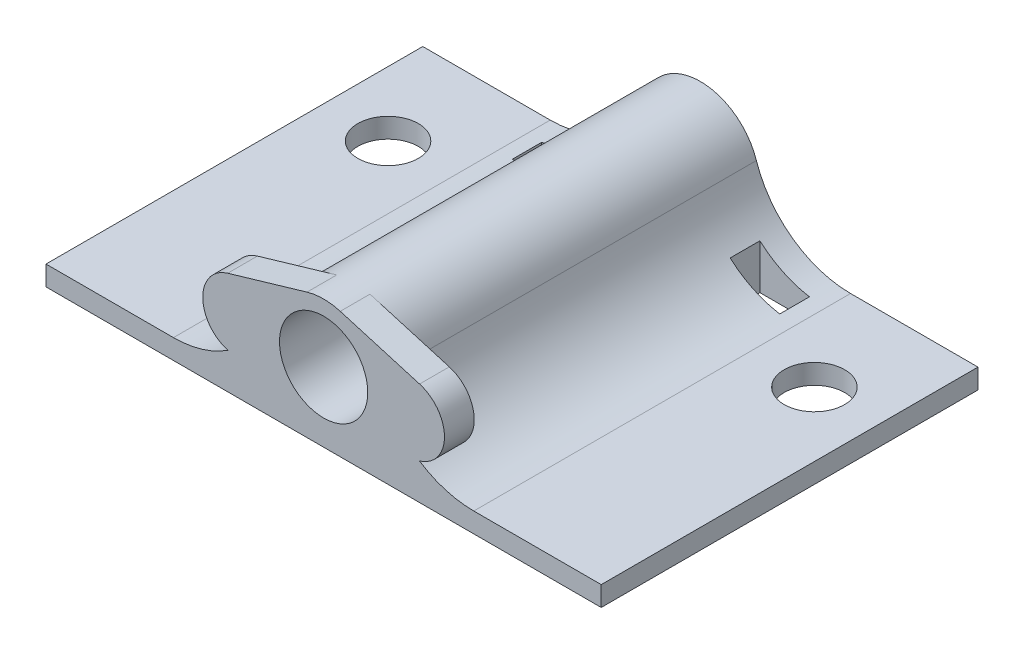
ISO-10303-21;
HEADER;
FILE_DESCRIPTION(('STEP AP214'),'2;1');
FILE_NAME('part.step','',(''),(''),'','','');
FILE_SCHEMA(('AUTOMOTIVE_DESIGN { 1 0 10303 214 1 1 1 1 }'));
ENDSEC;
DATA;
#1=APPLICATION_CONTEXT('core data for automotive mechanical design processes');
#2=APPLICATION_PROTOCOL_DEFINITION('international standard','automotive_design',2000,#1);
#3=PRODUCT_CONTEXT('',#1,'mechanical');
#4=PRODUCT('Part','Part','',(#3));
#5=PRODUCT_RELATED_PRODUCT_CATEGORY('part','',(#4));
#6=PRODUCT_DEFINITION_FORMATION('','',#4);
#7=PRODUCT_DEFINITION_CONTEXT('part definition',#1,'design');
#8=PRODUCT_DEFINITION('design','',#6,#7);
#9=PRODUCT_DEFINITION_SHAPE('','',#8);
#10=(LENGTH_UNIT() NAMED_UNIT(*) SI_UNIT(.MILLI.,.METRE.));
#11=(NAMED_UNIT(*) PLANE_ANGLE_UNIT() SI_UNIT($,.RADIAN.));
#12=(NAMED_UNIT(*) SI_UNIT($,.STERADIAN.) SOLID_ANGLE_UNIT());
#13=UNCERTAINTY_MEASURE_WITH_UNIT(LENGTH_MEASURE(1.E-05),#10,'distance_accuracy_value','');
#14=(GEOMETRIC_REPRESENTATION_CONTEXT(3) GLOBAL_UNCERTAINTY_ASSIGNED_CONTEXT((#13)) GLOBAL_UNIT_ASSIGNED_CONTEXT((#10,
#11,#12)) REPRESENTATION_CONTEXT('',''));
#15=CARTESIAN_POINT('',(0.,0.,0.));
#16=DIRECTION('',(0.,0.,1.));
#17=DIRECTION('',(1.,0.,0.));
#18=AXIS2_PLACEMENT_3D('',#15,#16,#17);
#19=CARTESIAN_POINT('',(0.,0.,35.));
#20=DIRECTION('',(0.,0.,-1.));
#21=DIRECTION('',(-1.,0.,0.));
#22=AXIS2_PLACEMENT_3D('',#19,#20,#21);
#23=CYLINDRICAL_SURFACE('',#22,4.45);
#24=CARTESIAN_POINT('',(0.,0.,38.));
#25=DIRECTION('',(0.,0.,1.));
#26=DIRECTION('',(1.,0.,0.));
#27=AXIS2_PLACEMENT_3D('',#24,#25,#26);
#28=CIRCLE('',#27,4.45);
#29=CARTESIAN_POINT('',(4.45,0.,38.));
#30=VERTEX_POINT('',#29);
#31=EDGE_CURVE('E324',#30,#30,#28,.F.);
#32=ORIENTED_EDGE('',*,*,#31,.F.);
#33=EDGE_LOOP('',(#32));
#34=FACE_BOUND('',#33,.T.);
#35=CARTESIAN_POINT('',(0.,0.,0.));
#36=DIRECTION('',(0.,0.,-1.));
#37=DIRECTION('',(-1.,0.,0.));
#38=AXIS2_PLACEMENT_3D('',#35,#36,#37);
#39=CIRCLE('',#38,4.45);
#40=CARTESIAN_POINT('',(-4.45,0.,0.));
#41=VERTEX_POINT('',#40);
#42=EDGE_CURVE('E235',#41,#41,#39,.T.);
#43=ORIENTED_EDGE('',*,*,#42,.T.);
#44=EDGE_LOOP('',(#43));
#45=FACE_BOUND('',#44,.T.);
#46=ADVANCED_FACE('F40',(#34,#45),#23,.F.);
#47=CARTESIAN_POINT('',(0.,0.,35.));
#48=DIRECTION('',(0.,0.,1.));
#49=DIRECTION('',(1.,0.,0.));
#50=AXIS2_PLACEMENT_3D('',#47,#48,#49);
#51=PLANE('',#50);
#52=CARTESIAN_POINT('',(0.,0.,35.));
#53=DIRECTION('',(0.,0.,1.));
#54=DIRECTION('',(1.,0.,0.));
#55=AXIS2_PLACEMENT_3D('',#52,#53,#54);
#56=CIRCLE('',#55,5.95);
#57=CARTESIAN_POINT('',(-1.6773711862172,5.70867111538652,35.));
#58=VERTEX_POINT('',#57);
#59=CARTESIAN_POINT('',(-5.65008981584658,1.86520376175549,35.));
#60=VERTEX_POINT('',#59);
#61=EDGE_CURVE('E360',#58,#60,#56,.T.);
#62=ORIENTED_EDGE('',*,*,#61,.T.);
#63=CARTESIAN_POINT('',(-15.146039086177,5.,35.));
#64=DIRECTION('',(0.,0.,1.));
#65=DIRECTION('',(1.,0.,0.));
#66=AXIS2_PLACEMENT_3D('',#63,#64,#65);
#67=CIRCLE('',#66,10.);
#68=CARTESIAN_POINT('',(-9.66244493894468,-3.36242759182045,35.));
#69=VERTEX_POINT('',#68);
#70=EDGE_CURVE('E375',#60,#69,#67,.F.);
#71=ORIENTED_EDGE('',*,*,#70,.T.);
#72=DIRECTION('',(-0.959440523594372,0.281911123733982,0.));
#73=VECTOR('',#72,1.);
#74=CARTESIAN_POINT('',(-1.67737118621719,-5.70867111538652,35.));
#75=LINE('',#74,#73);
#76=CARTESIAN_POINT('',(-9.67737118621719,-3.3580418325803,35.));
#77=VERTEX_POINT('',#76);
#78=EDGE_CURVE('E339',#69,#77,#75,.T.);
#79=ORIENTED_EDGE('',*,*,#78,.T.);
#80=CARTESIAN_POINT('',(-8.69068225314826,0.,35.));
#81=DIRECTION('',(0.,0.,1.));
#82=DIRECTION('',(1.,0.,0.));
#83=AXIS2_PLACEMENT_3D('',#80,#81,#82);
#84=CIRCLE('',#83,3.5);
#85=CARTESIAN_POINT('',(-9.67737118621719,3.3580418325803,35.));
#86=VERTEX_POINT('',#85);
#87=EDGE_CURVE('E336',#77,#86,#84,.F.);
#88=ORIENTED_EDGE('',*,*,#87,.T.);
#89=DIRECTION('',(-0.959440523594372,-0.281911123733982,0.));
#90=VECTOR('',#89,1.);
#91=CARTESIAN_POINT('',(-1.67737118621719,5.70867111538652,35.));
#92=LINE('',#91,#90);
#93=EDGE_CURVE('E333',#58,#86,#92,.T.);
#94=ORIENTED_EDGE('',*,*,#93,.F.);
#95=EDGE_LOOP('',(#62,#71,#79,#88,#94));
#96=FACE_BOUND('',#95,.T.);
#97=ADVANCED_FACE('F428',(#96),#51,.F.);
#98=DIRECTION('',(0.959440523594372,0.281911123733982,0.));
#99=VECTOR('',#98,1.);
#100=CARTESIAN_POINT('',(1.67737118621719,-5.70867111538652,35.));
#101=LINE('',#100,#99);
#102=CARTESIAN_POINT('',(9.66244493894468,-3.36242759182045,35.));
#103=VERTEX_POINT('',#102);
#104=CARTESIAN_POINT('',(9.67737118621719,-3.3580418325803,35.));
#105=VERTEX_POINT('',#104);
#106=EDGE_CURVE('E310',#103,#105,#101,.T.);
#107=ORIENTED_EDGE('',*,*,#106,.F.);
#108=CARTESIAN_POINT('',(15.146039086177,5.,35.));
#109=DIRECTION('',(0.,0.,1.));
#110=DIRECTION('',(1.,0.,0.));
#111=AXIS2_PLACEMENT_3D('',#108,#109,#110);
#112=CIRCLE('',#111,10.);
#113=CARTESIAN_POINT('',(5.65008981584658,1.86520376175549,35.));
#114=VERTEX_POINT('',#113);
#115=EDGE_CURVE('E373',#103,#114,#112,.F.);
#116=ORIENTED_EDGE('',*,*,#115,.T.);
#117=CARTESIAN_POINT('',(1.67737118621719,5.70867111538652,35.));
#118=VERTEX_POINT('',#117);
#119=EDGE_CURVE('E358',#114,#118,#56,.T.);
#120=ORIENTED_EDGE('',*,*,#119,.T.);
#121=DIRECTION('',(0.959440523594372,-0.281911123733982,0.));
#122=VECTOR('',#121,1.);
#123=CARTESIAN_POINT('',(1.67737118621719,5.70867111538652,35.));
#124=LINE('',#123,#122);
#125=CARTESIAN_POINT('',(9.67737118621719,3.3580418325803,35.));
#126=VERTEX_POINT('',#125);
#127=EDGE_CURVE('E330',#118,#126,#124,.T.);
#128=ORIENTED_EDGE('',*,*,#127,.T.);
#129=CARTESIAN_POINT('',(8.69068225314826,0.,35.));
#130=DIRECTION('',(0.,0.,1.));
#131=DIRECTION('',(1.,0.,0.));
#132=AXIS2_PLACEMENT_3D('',#129,#130,#131);
#133=CIRCLE('',#132,3.5);
#134=EDGE_CURVE('E299',#126,#105,#133,.F.);
#135=ORIENTED_EDGE('',*,*,#134,.T.);
#136=EDGE_LOOP('',(#107,#116,#120,#128,#135));
#137=FACE_BOUND('',#136,.T.);
#138=ADVANCED_FACE('F434',(#137),#51,.F.);
#139=CARTESIAN_POINT('',(8.69068225314826,0.,38.));
#140=DIRECTION('',(0.,0.,-1.));
#141=DIRECTION('',(-1.,0.,0.));
#142=AXIS2_PLACEMENT_3D('',#139,#140,#141);
#143=CYLINDRICAL_SURFACE('',#142,3.5);
#144=ORIENTED_EDGE('',*,*,#134,.F.);
#145=DIRECTION('',(0.,0.,-1.));
#146=VECTOR('',#145,1.);
#147=CARTESIAN_POINT('',(9.67737118621719,3.3580418325803,38.));
#148=LINE('',#147,#146);
#149=CARTESIAN_POINT('',(9.67737118621719,3.3580418325803,38.));
#150=VERTEX_POINT('',#149);
#151=EDGE_CURVE('E355',#150,#126,#148,.T.);
#152=ORIENTED_EDGE('',*,*,#151,.F.);
#153=CARTESIAN_POINT('',(8.69068225314826,0.,38.));
#154=DIRECTION('',(0.,0.,1.));
#155=DIRECTION('',(1.,0.,0.));
#156=AXIS2_PLACEMENT_3D('',#153,#154,#155);
#157=CIRCLE('',#156,3.5);
#158=CARTESIAN_POINT('',(9.67737118621719,-3.3580418325803,38.));
#159=VERTEX_POINT('',#158);
#160=EDGE_CURVE('E306',#150,#159,#157,.F.);
#161=ORIENTED_EDGE('',*,*,#160,.T.);
#162=DIRECTION('',(0.,0.,-1.));
#163=VECTOR('',#162,1.);
#164=CARTESIAN_POINT('',(9.67737118621719,-3.3580418325803,38.));
#165=LINE('',#164,#163);
#166=EDGE_CURVE('E327',#159,#105,#165,.T.);
#167=ORIENTED_EDGE('',*,*,#166,.T.);
#168=EDGE_LOOP('',(#144,#152,#161,#167));
#169=FACE_BOUND('',#168,.T.);
#170=ADVANCED_FACE('F441',(#169),#143,.T.);
#171=CARTESIAN_POINT('',(1.67737118621719,5.70867111538652,38.));
#172=DIRECTION('',(0.281911123733982,0.959440523594372,0.));
#173=DIRECTION('',(-0.959440523594372,0.281911123733982,0.));
#174=AXIS2_PLACEMENT_3D('',#171,#172,#173);
#175=PLANE('',#174);
#176=ORIENTED_EDGE('',*,*,#127,.F.);
#177=DIRECTION('',(0.,0.,-1.));
#178=VECTOR('',#177,1.);
#179=CARTESIAN_POINT('',(1.67737118621719,5.70867111538652,38.));
#180=LINE('',#179,#178);
#181=CARTESIAN_POINT('',(1.67737118621719,5.70867111538652,38.));
#182=VERTEX_POINT('',#181);
#183=EDGE_CURVE('E352',#182,#118,#180,.T.);
#184=ORIENTED_EDGE('',*,*,#183,.F.);
#185=DIRECTION('',(0.959440523594372,-0.281911123733982,0.));
#186=VECTOR('',#185,1.);
#187=CARTESIAN_POINT('',(1.67737118621719,5.70867111538652,38.));
#188=LINE('',#187,#186);
#189=EDGE_CURVE('E309',#182,#150,#188,.T.);
#190=ORIENTED_EDGE('',*,*,#189,.T.);
#191=ORIENTED_EDGE('',*,*,#151,.T.);
#192=EDGE_LOOP('',(#176,#184,#190,#191));
#193=FACE_BOUND('',#192,.T.);
#194=ADVANCED_FACE('F503',(#193),#175,.T.);
#195=CARTESIAN_POINT('',(-1.67737118621719,5.70867111538652,38.));
#196=DIRECTION('',(0.281911123733982,-0.959440523594372,0.));
#197=DIRECTION('',(0.959440523594372,0.281911123733982,0.));
#198=AXIS2_PLACEMENT_3D('',#195,#196,#197);
#199=PLANE('',#198);
#200=ORIENTED_EDGE('',*,*,#93,.T.);
#201=DIRECTION('',(0.,0.,-1.));
#202=VECTOR('',#201,1.);
#203=CARTESIAN_POINT('',(-9.67737118621719,3.3580418325803,38.));
#204=LINE('',#203,#202);
#205=CARTESIAN_POINT('',(-9.67737118621719,3.3580418325803,38.));
#206=VERTEX_POINT('',#205);
#207=EDGE_CURVE('E347',#206,#86,#204,.T.);
#208=ORIENTED_EDGE('',*,*,#207,.F.);
#209=DIRECTION('',(-0.959440523594372,-0.281911123733982,0.));
#210=VECTOR('',#209,1.);
#211=CARTESIAN_POINT('',(-1.67737118621719,5.70867111538652,38.));
#212=LINE('',#211,#210);
#213=CARTESIAN_POINT('',(-1.67737118621719,5.70867111538652,38.));
#214=VERTEX_POINT('',#213);
#215=EDGE_CURVE('E315',#214,#206,#212,.T.);
#216=ORIENTED_EDGE('',*,*,#215,.F.);
#217=DIRECTION('',(0.,0.,-1.));
#218=VECTOR('',#217,1.);
#219=CARTESIAN_POINT('',(-1.67737118621719,5.70867111538652,38.));
#220=LINE('',#219,#218);
#221=EDGE_CURVE('E349',#214,#58,#220,.T.);
#222=ORIENTED_EDGE('',*,*,#221,.T.);
#223=EDGE_LOOP('',(#200,#208,#216,#222));
#224=FACE_BOUND('',#223,.T.);
#225=ADVANCED_FACE('F511',(#224),#199,.F.);
#226=CARTESIAN_POINT('',(-8.69068225314826,0.,38.));
#227=DIRECTION('',(0.,0.,-1.));
#228=DIRECTION('',(-1.,0.,0.));
#229=AXIS2_PLACEMENT_3D('',#226,#227,#228);
#230=CYLINDRICAL_SURFACE('',#229,3.5);
#231=ORIENTED_EDGE('',*,*,#87,.F.);
#232=DIRECTION('',(0.,0.,-1.));
#233=VECTOR('',#232,1.);
#234=CARTESIAN_POINT('',(-9.67737118621719,-3.3580418325803,38.));
#235=LINE('',#234,#233);
#236=CARTESIAN_POINT('',(-9.67737118621719,-3.3580418325803,38.));
#237=VERTEX_POINT('',#236);
#238=EDGE_CURVE('E344',#237,#77,#235,.T.);
#239=ORIENTED_EDGE('',*,*,#238,.F.);
#240=CARTESIAN_POINT('',(-8.69068225314826,0.,38.));
#241=DIRECTION('',(0.,0.,1.));
#242=DIRECTION('',(1.,0.,0.));
#243=AXIS2_PLACEMENT_3D('',#240,#241,#242);
#244=CIRCLE('',#243,3.5);
#245=EDGE_CURVE('E317',#237,#206,#244,.F.);
#246=ORIENTED_EDGE('',*,*,#245,.T.);
#247=ORIENTED_EDGE('',*,*,#207,.T.);
#248=EDGE_LOOP('',(#231,#239,#246,#247));
#249=FACE_BOUND('',#248,.T.);
#250=ADVANCED_FACE('F516',(#249),#230,.T.);
#251=CARTESIAN_POINT('',(-1.67737118621719,-5.70867111538652,38.));
#252=DIRECTION('',(-0.281911123733982,-0.959440523594372,0.));
#253=DIRECTION('',(0.959440523594372,-0.281911123733982,0.));
#254=AXIS2_PLACEMENT_3D('',#251,#252,#253);
#255=PLANE('',#254);
#256=ORIENTED_EDGE('',*,*,#78,.F.);
#257=DIRECTION('',(0.,0.,-1.));
#258=VECTOR('',#257,1.);
#259=CARTESIAN_POINT('',(-9.66244493894467,-3.36242759182045,35.));
#260=LINE('',#259,#258);
#261=CARTESIAN_POINT('',(-9.66244493894468,-3.36242759182045,38.));
#262=VERTEX_POINT('',#261);
#263=EDGE_CURVE('E377',#69,#262,#260,.F.);
#264=ORIENTED_EDGE('',*,*,#263,.T.);
#265=DIRECTION('',(-0.959440523594372,0.281911123733982,0.));
#266=VECTOR('',#265,1.);
#267=CARTESIAN_POINT('',(-1.67737118621719,-5.70867111538652,38.));
#268=LINE('',#267,#266);
#269=EDGE_CURVE('E320',#262,#237,#268,.T.);
#270=ORIENTED_EDGE('',*,*,#269,.T.);
#271=ORIENTED_EDGE('',*,*,#238,.T.);
#272=EDGE_LOOP('',(#256,#264,#270,#271));
#273=FACE_BOUND('',#272,.T.);
#274=ADVANCED_FACE('F519',(#273),#255,.T.);
#275=CARTESIAN_POINT('',(1.67737118621719,-5.70867111538652,38.));
#276=DIRECTION('',(-0.281911123733982,0.959440523594372,0.));
#277=DIRECTION('',(-0.959440523594372,-0.281911123733982,0.));
#278=AXIS2_PLACEMENT_3D('',#275,#276,#277);
#279=PLANE('',#278);
#280=DIRECTION('',(0.959440523594372,0.281911123733982,0.));
#281=VECTOR('',#280,1.);
#282=CARTESIAN_POINT('',(1.67737118621719,-5.70867111538652,38.));
#283=LINE('',#282,#281);
#284=CARTESIAN_POINT('',(9.66244493894468,-3.36242759182045,38.));
#285=VERTEX_POINT('',#284);
#286=EDGE_CURVE('E322',#285,#159,#283,.T.);
#287=ORIENTED_EDGE('',*,*,#286,.F.);
#288=DIRECTION('',(0.,0.,-1.));
#289=VECTOR('',#288,1.);
#290=CARTESIAN_POINT('',(9.66244493894467,-3.36242759182045,38.));
#291=LINE('',#290,#289);
#292=EDGE_CURVE('E371',#285,#103,#291,.T.);
#293=ORIENTED_EDGE('',*,*,#292,.T.);
#294=ORIENTED_EDGE('',*,*,#106,.T.);
#295=ORIENTED_EDGE('',*,*,#166,.F.);
#296=EDGE_LOOP('',(#287,#293,#294,#295));
#297=FACE_BOUND('',#296,.T.);
#298=ADVANCED_FACE('F496',(#297),#279,.F.);
#299=CARTESIAN_POINT('',(0.,0.,38.));
#300=DIRECTION('',(0.,0.,1.));
#301=DIRECTION('',(1.,0.,0.));
#302=AXIS2_PLACEMENT_3D('',#299,#300,#301);
#303=PLANE('',#302);
#304=ORIENTED_EDGE('',*,*,#269,.F.);
#305=CARTESIAN_POINT('',(-15.146039086177,5.,38.));
#306=DIRECTION('',(0.,0.,1.));
#307=DIRECTION('',(1.,0.,0.));
#308=AXIS2_PLACEMENT_3D('',#305,#306,#307);
#309=CIRCLE('',#308,10.);
#310=CARTESIAN_POINT('',(-15.146039086177,-5.,38.));
#311=VERTEX_POINT('',#310);
#312=EDGE_CURVE('E385',#262,#311,#309,.F.);
#313=ORIENTED_EDGE('',*,*,#312,.T.);
#314=DIRECTION('',(1.,0.,0.));
#315=VECTOR('',#314,1.);
#316=CARTESIAN_POINT('',(0.,-5.,38.));
#317=LINE('',#316,#315);
#318=CARTESIAN_POINT('',(-28.,-5.,38.));
#319=VERTEX_POINT('',#318);
#320=EDGE_CURVE('E288',#319,#311,#317,.T.);
#321=ORIENTED_EDGE('',*,*,#320,.F.);
#322=DIRECTION('',(0.,1.,0.));
#323=VECTOR('',#322,1.);
#324=CARTESIAN_POINT('',(-28.,-7.,38.));
#325=LINE('',#324,#323);
#326=CARTESIAN_POINT('',(-28.,-7.,38.));
#327=VERTEX_POINT('',#326);
#328=EDGE_CURVE('E303',#327,#319,#325,.T.);
#329=ORIENTED_EDGE('',*,*,#328,.F.);
#330=DIRECTION('',(1.,0.,0.));
#331=VECTOR('',#330,1.);
#332=CARTESIAN_POINT('',(0.,-7.,38.));
#333=LINE('',#332,#331);
#334=CARTESIAN_POINT('',(28.,-7.,38.));
#335=VERTEX_POINT('',#334);
#336=EDGE_CURVE('E269',#327,#335,#333,.T.);
#337=ORIENTED_EDGE('',*,*,#336,.T.);
#338=DIRECTION('',(0.,1.,0.));
#339=VECTOR('',#338,1.);
#340=CARTESIAN_POINT('',(28.,-7.,38.));
#341=LINE('',#340,#339);
#342=CARTESIAN_POINT('',(28.,-5.,38.));
#343=VERTEX_POINT('',#342);
#344=EDGE_CURVE('E300',#335,#343,#341,.T.);
#345=ORIENTED_EDGE('',*,*,#344,.T.);
#346=CARTESIAN_POINT('',(15.146039086177,-5.,38.));
#347=VERTEX_POINT('',#346);
#348=EDGE_CURVE('E287',#347,#343,#317,.T.);
#349=ORIENTED_EDGE('',*,*,#348,.F.);
#350=CARTESIAN_POINT('',(15.146039086177,5.,38.));
#351=DIRECTION('',(0.,0.,1.));
#352=DIRECTION('',(1.,0.,0.));
#353=AXIS2_PLACEMENT_3D('',#350,#351,#352);
#354=CIRCLE('',#353,10.);
#355=EDGE_CURVE('E383',#347,#285,#354,.F.);
#356=ORIENTED_EDGE('',*,*,#355,.T.);
#357=ORIENTED_EDGE('',*,*,#286,.T.);
#358=ORIENTED_EDGE('',*,*,#160,.F.);
#359=ORIENTED_EDGE('',*,*,#189,.F.);
#360=CARTESIAN_POINT('',(0.,0.,38.));
#361=DIRECTION('',(0.,0.,1.));
#362=DIRECTION('',(1.,0.,0.));
#363=AXIS2_PLACEMENT_3D('',#360,#361,#362);
#364=CIRCLE('',#363,5.95);
#365=EDGE_CURVE('E313',#182,#214,#364,.T.);
#366=ORIENTED_EDGE('',*,*,#365,.T.);
#367=ORIENTED_EDGE('',*,*,#215,.T.);
#368=ORIENTED_EDGE('',*,*,#245,.F.);
#369=EDGE_LOOP('',(#304,#313,#321,#329,#337,#345,#349,#356,#357,#358,#359,#366,#367,#368));
#370=FACE_BOUND('',#369,.T.);
#371=ORIENTED_EDGE('',*,*,#31,.T.);
#372=EDGE_LOOP('',(#371));
#373=FACE_BOUND('',#372,.T.);
#374=ADVANCED_FACE('F450',(#370,#373),#303,.T.);
#375=CARTESIAN_POINT('',(0.,0.,0.));
#376=DIRECTION('',(0.,0.,1.));
#377=DIRECTION('',(1.,0.,0.));
#378=AXIS2_PLACEMENT_3D('',#375,#376,#377);
#379=PLANE('',#378);
#380=ORIENTED_EDGE('',*,*,#42,.F.);
#381=EDGE_LOOP('',(#380));
#382=FACE_BOUND('',#381,.T.);
#383=CARTESIAN_POINT('',(0.,0.,0.));
#384=DIRECTION('',(0.,0.,1.));
#385=DIRECTION('',(1.,0.,0.));
#386=AXIS2_PLACEMENT_3D('',#383,#384,#385);
#387=CIRCLE('',#386,5.95);
#388=CARTESIAN_POINT('',(5.65008981584658,1.86520376175549,0.));
#389=VERTEX_POINT('',#388);
#390=CARTESIAN_POINT('',(-5.65008981584658,1.86520376175549,0.));
#391=VERTEX_POINT('',#390);
#392=EDGE_CURVE('E357',#389,#391,#387,.T.);
#393=ORIENTED_EDGE('',*,*,#392,.F.);
#394=CARTESIAN_POINT('',(15.146039086177,5.,0.));
#395=DIRECTION('',(0.,0.,1.));
#396=DIRECTION('',(1.,0.,0.));
#397=AXIS2_PLACEMENT_3D('',#394,#395,#396);
#398=CIRCLE('',#397,10.);
#399=CARTESIAN_POINT('',(15.146039086177,-5.,0.));
#400=VERTEX_POINT('',#399);
#401=EDGE_CURVE('E381',#389,#400,#398,.T.);
#402=ORIENTED_EDGE('',*,*,#401,.T.);
#403=DIRECTION('',(1.,0.,0.));
#404=VECTOR('',#403,1.);
#405=CARTESIAN_POINT('',(0.,-5.,0.));
#406=LINE('',#405,#404);
#407=CARTESIAN_POINT('',(28.,-5.,0.));
#408=VERTEX_POINT('',#407);
#409=EDGE_CURVE('E280',#400,#408,#406,.T.);
#410=ORIENTED_EDGE('',*,*,#409,.T.);
#411=DIRECTION('',(0.,1.,0.));
#412=VECTOR('',#411,1.);
#413=CARTESIAN_POINT('',(28.,-7.,0.));
#414=LINE('',#413,#412);
#415=CARTESIAN_POINT('',(28.,-7.,0.));
#416=VERTEX_POINT('',#415);
#417=EDGE_CURVE('E296',#416,#408,#414,.T.);
#418=ORIENTED_EDGE('',*,*,#417,.F.);
#419=DIRECTION('',(1.,0.,0.));
#420=VECTOR('',#419,1.);
#421=CARTESIAN_POINT('',(0.,-7.,0.));
#422=LINE('',#421,#420);
#423=CARTESIAN_POINT('',(-28.,-7.,0.));
#424=VERTEX_POINT('',#423);
#425=EDGE_CURVE('E262',#424,#416,#422,.T.);
#426=ORIENTED_EDGE('',*,*,#425,.F.);
#427=DIRECTION('',(0.,1.,0.));
#428=VECTOR('',#427,1.);
#429=CARTESIAN_POINT('',(-28.,-7.,0.));
#430=LINE('',#429,#428);
#431=CARTESIAN_POINT('',(-28.,-5.,0.));
#432=VERTEX_POINT('',#431);
#433=EDGE_CURVE('E277',#424,#432,#430,.T.);
#434=ORIENTED_EDGE('',*,*,#433,.T.);
#435=CARTESIAN_POINT('',(-15.146039086177,-5.,0.));
#436=VERTEX_POINT('',#435);
#437=EDGE_CURVE('E281',#432,#436,#406,.T.);
#438=ORIENTED_EDGE('',*,*,#437,.T.);
#439=CARTESIAN_POINT('',(-15.146039086177,5.,0.));
#440=DIRECTION('',(0.,0.,1.));
#441=DIRECTION('',(1.,0.,0.));
#442=AXIS2_PLACEMENT_3D('',#439,#440,#441);
#443=CIRCLE('',#442,10.);
#444=EDGE_CURVE('E387',#436,#391,#443,.T.);
#445=ORIENTED_EDGE('',*,*,#444,.T.);
#446=EDGE_LOOP('',(#393,#402,#410,#418,#426,#434,#438,#445));
#447=FACE_BOUND('',#446,.T.);
#448=ADVANCED_FACE('F447',(#382,#447),#379,.F.);
#449=CARTESIAN_POINT('',(0.,0.,35.));
#450=DIRECTION('',(0.,0.,-1.));
#451=DIRECTION('',(-1.,0.,0.));
#452=AXIS2_PLACEMENT_3D('',#449,#450,#451);
#453=CYLINDRICAL_SURFACE('',#452,5.95);
#454=ORIENTED_EDGE('',*,*,#119,.F.);
#455=DIRECTION('',(0.,0.,-1.));
#456=VECTOR('',#455,1.);
#457=CARTESIAN_POINT('',(5.65008981584658,1.86520376175549,35.));
#458=LINE('',#457,#456);
#459=EDGE_CURVE('E366',#114,#389,#458,.T.);
#460=ORIENTED_EDGE('',*,*,#459,.T.);
#461=ORIENTED_EDGE('',*,*,#392,.T.);
#462=DIRECTION('',(0.,0.,-1.));
#463=VECTOR('',#462,1.);
#464=CARTESIAN_POINT('',(-5.65008981584658,1.86520376175549,35.));
#465=LINE('',#464,#463);
#466=EDGE_CURVE('E363',#391,#60,#465,.F.);
#467=ORIENTED_EDGE('',*,*,#466,.T.);
#468=ORIENTED_EDGE('',*,*,#61,.F.);
#469=ORIENTED_EDGE('',*,*,#221,.F.);
#470=ORIENTED_EDGE('',*,*,#365,.F.);
#471=ORIENTED_EDGE('',*,*,#183,.T.);
#472=EDGE_LOOP('',(#454,#460,#461,#467,#468,#469,#470,#471));
#473=FACE_BOUND('',#472,.T.);
#474=ADVANCED_FACE('F443',(#473),#453,.T.);
#475=CARTESIAN_POINT('',(0.,-5.,0.));
#476=DIRECTION('',(0.,1.,0.));
#477=DIRECTION('',(0.,0.,1.));
#478=AXIS2_PLACEMENT_3D('',#475,#476,#477);
#479=PLANE('',#478);
#480=CARTESIAN_POINT('',(21.5,-5.,9.99999999999999));
#481=DIRECTION('',(0.,1.,0.));
#482=DIRECTION('',(0.,0.,1.));
#483=AXIS2_PLACEMENT_3D('',#480,#481,#482);
#484=CIRCLE('',#483,3.05000000000001);
#485=CARTESIAN_POINT('',(21.5,-5.,13.05));
#486=VERTEX_POINT('',#485);
#487=EDGE_CURVE('E258',#486,#486,#484,.F.);
#488=ORIENTED_EDGE('',*,*,#487,.T.);
#489=EDGE_LOOP('',(#488));
#490=FACE_BOUND('',#489,.T.);
#491=ORIENTED_EDGE('',*,*,#409,.F.);
#492=DIRECTION('',(0.,0.,-1.));
#493=VECTOR('',#492,1.);
#494=CARTESIAN_POINT('',(15.146039086177,-5.,0.));
#495=LINE('',#494,#493);
#496=EDGE_CURVE('E369',#400,#347,#495,.F.);
#497=ORIENTED_EDGE('',*,*,#496,.T.);
#498=ORIENTED_EDGE('',*,*,#348,.T.);
#499=DIRECTION('',(0.,0.,1.));
#500=VECTOR('',#499,1.);
#501=CARTESIAN_POINT('',(28.,-5.,0.));
#502=LINE('',#501,#500);
#503=EDGE_CURVE('E291',#408,#343,#502,.T.);
#504=ORIENTED_EDGE('',*,*,#503,.F.);
#505=EDGE_LOOP('',(#491,#497,#498,#504));
#506=FACE_BOUND('',#505,.T.);
#507=ADVANCED_FACE('F446',(#490,#506),#479,.T.);
#508=CARTESIAN_POINT('',(28.,-7.,0.));
#509=DIRECTION('',(-1.,0.,0.));
#510=DIRECTION('',(0.,0.,1.));
#511=AXIS2_PLACEMENT_3D('',#508,#509,#510);
#512=PLANE('',#511);
#513=ORIENTED_EDGE('',*,*,#503,.T.);
#514=ORIENTED_EDGE('',*,*,#344,.F.);
#515=DIRECTION('',(0.,0.,1.));
#516=VECTOR('',#515,1.);
#517=CARTESIAN_POINT('',(28.,-7.,0.));
#518=LINE('',#517,#516);
#519=EDGE_CURVE('E272',#416,#335,#518,.T.);
#520=ORIENTED_EDGE('',*,*,#519,.F.);
#521=ORIENTED_EDGE('',*,*,#417,.T.);
#522=EDGE_LOOP('',(#513,#514,#520,#521));
#523=FACE_BOUND('',#522,.T.);
#524=ADVANCED_FACE('F469',(#523),#512,.F.);
#525=CARTESIAN_POINT('',(-28.,-7.,0.));
#526=DIRECTION('',(-1.,0.,0.));
#527=DIRECTION('',(0.,0.,1.));
#528=AXIS2_PLACEMENT_3D('',#525,#526,#527);
#529=PLANE('',#528);
#530=DIRECTION('',(0.,0.,1.));
#531=VECTOR('',#530,1.);
#532=CARTESIAN_POINT('',(-28.,-5.,0.));
#533=LINE('',#532,#531);
#534=EDGE_CURVE('E284',#432,#319,#533,.T.);
#535=ORIENTED_EDGE('',*,*,#534,.F.);
#536=ORIENTED_EDGE('',*,*,#433,.F.);
#537=DIRECTION('',(0.,0.,1.));
#538=VECTOR('',#537,1.);
#539=CARTESIAN_POINT('',(-28.,-7.,0.));
#540=LINE('',#539,#538);
#541=EDGE_CURVE('E266',#424,#327,#540,.T.);
#542=ORIENTED_EDGE('',*,*,#541,.T.);
#543=ORIENTED_EDGE('',*,*,#328,.T.);
#544=EDGE_LOOP('',(#535,#536,#542,#543));
#545=FACE_BOUND('',#544,.T.);
#546=ADVANCED_FACE('F474',(#545),#529,.T.);
#547=CARTESIAN_POINT('',(21.5,-7.,9.99999999999999));
#548=DIRECTION('',(0.,1.,0.));
#549=DIRECTION('',(0.,0.,1.));
#550=AXIS2_PLACEMENT_3D('',#547,#548,#549);
#551=CYLINDRICAL_SURFACE('',#550,3.05000000000001);
#552=CARTESIAN_POINT('',(21.5,-7.,9.99999999999999));
#553=DIRECTION('',(0.,1.,0.));
#554=DIRECTION('',(0.,0.,1.));
#555=AXIS2_PLACEMENT_3D('',#552,#553,#554);
#556=CIRCLE('',#555,3.05000000000001);
#557=CARTESIAN_POINT('',(21.5,-7.,13.05));
#558=VERTEX_POINT('',#557);
#559=EDGE_CURVE('E259',#558,#558,#556,.F.);
#560=ORIENTED_EDGE('',*,*,#559,.T.);
#561=EDGE_LOOP('',(#560));
#562=FACE_BOUND('',#561,.T.);
#563=ORIENTED_EDGE('',*,*,#487,.F.);
#564=EDGE_LOOP('',(#563));
#565=FACE_BOUND('',#564,.T.);
#566=ADVANCED_FACE('F541',(#562,#565),#551,.F.);
#567=CARTESIAN_POINT('',(-21.5,-7.,10.));
#568=DIRECTION('',(0.,1.,0.));
#569=DIRECTION('',(0.,0.,1.));
#570=AXIS2_PLACEMENT_3D('',#567,#568,#569);
#571=CYLINDRICAL_SURFACE('',#570,3.05000000000001);
#572=CARTESIAN_POINT('',(-21.5,-7.,10.));
#573=DIRECTION('',(0.,1.,0.));
#574=DIRECTION('',(0.,0.,1.));
#575=AXIS2_PLACEMENT_3D('',#572,#573,#574);
#576=CIRCLE('',#575,3.05000000000001);
#577=CARTESIAN_POINT('',(-21.5,-7.,13.05));
#578=VERTEX_POINT('',#577);
#579=EDGE_CURVE('E274',#578,#578,#576,.T.);
#580=ORIENTED_EDGE('',*,*,#579,.F.);
#581=EDGE_LOOP('',(#580));
#582=FACE_BOUND('',#581,.T.);
#583=CARTESIAN_POINT('',(-21.5,-5.,10.));
#584=DIRECTION('',(0.,1.,0.));
#585=DIRECTION('',(0.,0.,1.));
#586=AXIS2_PLACEMENT_3D('',#583,#584,#585);
#587=CIRCLE('',#586,3.05000000000001);
#588=CARTESIAN_POINT('',(-21.5,-5.,13.05));
#589=VERTEX_POINT('',#588);
#590=EDGE_CURVE('E263',#589,#589,#587,.T.);
#591=ORIENTED_EDGE('',*,*,#590,.T.);
#592=EDGE_LOOP('',(#591));
#593=FACE_BOUND('',#592,.T.);
#594=ADVANCED_FACE('F464',(#582,#593),#571,.F.);
#595=CARTESIAN_POINT('',(0.,-7.,0.));
#596=DIRECTION('',(0.,1.,0.));
#597=DIRECTION('',(0.,0.,1.));
#598=AXIS2_PLACEMENT_3D('',#595,#596,#597);
#599=PLANE('',#598);
#600=DIRECTION('',(-1.,0.,0.));
#601=VECTOR('',#600,1.);
#602=CARTESIAN_POINT('',(-13.5,-7.,2.50000000000001));
#603=LINE('',#602,#601);
#604=CARTESIAN_POINT('',(-8.5,-7.,2.50000000000001));
#605=VERTEX_POINT('',#604);
#606=CARTESIAN_POINT('',(-13.5,-7.,2.50000000000001));
#607=VERTEX_POINT('',#606);
#608=EDGE_CURVE('E215',#605,#607,#603,.T.);
#609=ORIENTED_EDGE('',*,*,#608,.T.);
#610=DIRECTION('',(0.,0.,1.));
#611=VECTOR('',#610,1.);
#612=CARTESIAN_POINT('',(-13.5,-7.,2.50000000000001));
#613=LINE('',#612,#611);
#614=CARTESIAN_POINT('',(-13.5,-7.,5.50000000000001));
#615=VERTEX_POINT('',#614);
#616=EDGE_CURVE('E208',#607,#615,#613,.T.);
#617=ORIENTED_EDGE('',*,*,#616,.T.);
#618=DIRECTION('',(1.,0.,0.));
#619=VECTOR('',#618,1.);
#620=CARTESIAN_POINT('',(-13.5,-7.,5.50000000000001));
#621=LINE('',#620,#619);
#622=CARTESIAN_POINT('',(-8.5,-7.,5.50000000000001));
#623=VERTEX_POINT('',#622);
#624=EDGE_CURVE('E218',#615,#623,#621,.T.);
#625=ORIENTED_EDGE('',*,*,#624,.T.);
#626=DIRECTION('',(0.,0.,-1.));
#627=VECTOR('',#626,1.);
#628=CARTESIAN_POINT('',(-8.5,-7.,2.50000000000001));
#629=LINE('',#628,#627);
#630=EDGE_CURVE('E55',#623,#605,#629,.T.);
#631=ORIENTED_EDGE('',*,*,#630,.T.);
#632=EDGE_LOOP('',(#609,#617,#625,#631));
#633=FACE_BOUND('',#632,.T.);
#634=DIRECTION('',(0.,0.,-1.));
#635=VECTOR('',#634,1.);
#636=CARTESIAN_POINT('',(13.5,-7.,2.5));
#637=LINE('',#636,#635);
#638=CARTESIAN_POINT('',(13.5,-7.,5.50000000000001));
#639=VERTEX_POINT('',#638);
#640=CARTESIAN_POINT('',(13.5,-7.,2.5));
#641=VERTEX_POINT('',#640);
#642=EDGE_CURVE('E247',#639,#641,#637,.T.);
#643=ORIENTED_EDGE('',*,*,#642,.T.);
#644=DIRECTION('',(-1.,0.,0.));
#645=VECTOR('',#644,1.);
#646=CARTESIAN_POINT('',(13.5,-7.,2.5));
#647=LINE('',#646,#645);
#648=CARTESIAN_POINT('',(8.5,-7.,2.50000000000001));
#649=VERTEX_POINT('',#648);
#650=EDGE_CURVE('E240',#641,#649,#647,.T.);
#651=ORIENTED_EDGE('',*,*,#650,.T.);
#652=DIRECTION('',(0.,0.,1.));
#653=VECTOR('',#652,1.);
#654=CARTESIAN_POINT('',(8.5,-7.,2.50000000000001));
#655=LINE('',#654,#653);
#656=CARTESIAN_POINT('',(8.5,-7.,5.50000000000001));
#657=VERTEX_POINT('',#656);
#658=EDGE_CURVE('E243',#649,#657,#655,.T.);
#659=ORIENTED_EDGE('',*,*,#658,.T.);
#660=DIRECTION('',(1.,0.,0.));
#661=VECTOR('',#660,1.);
#662=CARTESIAN_POINT('',(13.5,-7.,5.50000000000001));
#663=LINE('',#662,#661);
#664=EDGE_CURVE('E63',#657,#639,#663,.T.);
#665=ORIENTED_EDGE('',*,*,#664,.T.);
#666=EDGE_LOOP('',(#643,#651,#659,#665));
#667=FACE_BOUND('',#666,.T.);
#668=ORIENTED_EDGE('',*,*,#559,.F.);
#669=EDGE_LOOP('',(#668));
#670=FACE_BOUND('',#669,.T.);
#671=ORIENTED_EDGE('',*,*,#425,.T.);
#672=ORIENTED_EDGE('',*,*,#519,.T.);
#673=ORIENTED_EDGE('',*,*,#336,.F.);
#674=ORIENTED_EDGE('',*,*,#541,.F.);
#675=EDGE_LOOP('',(#671,#672,#673,#674));
#676=FACE_BOUND('',#675,.T.);
#677=ORIENTED_EDGE('',*,*,#579,.T.);
#678=EDGE_LOOP('',(#677));
#679=FACE_BOUND('',#678,.T.);
#680=ADVANCED_FACE('F222',(#633,#667,#670,#676,#679),#599,.F.);
#681=ORIENTED_EDGE('',*,*,#320,.T.);
#682=DIRECTION('',(0.,0.,-1.));
#683=VECTOR('',#682,1.);
#684=CARTESIAN_POINT('',(-15.146039086177,-5.,0.));
#685=LINE('',#684,#683);
#686=EDGE_CURVE('E379',#311,#436,#685,.T.);
#687=ORIENTED_EDGE('',*,*,#686,.T.);
#688=ORIENTED_EDGE('',*,*,#437,.F.);
#689=ORIENTED_EDGE('',*,*,#534,.T.);
#690=EDGE_LOOP('',(#681,#687,#688,#689));
#691=FACE_BOUND('',#690,.T.);
#692=ORIENTED_EDGE('',*,*,#590,.F.);
#693=EDGE_LOOP('',(#692));
#694=FACE_BOUND('',#693,.T.);
#695=ADVANCED_FACE('F453',(#691,#694),#479,.T.);
#696=CARTESIAN_POINT('',(15.146039086177,5.,35.));
#697=DIRECTION('',(0.,0.,-1.));
#698=DIRECTION('',(-1.,0.,0.));
#699=AXIS2_PLACEMENT_3D('',#696,#697,#698);
#700=CYLINDRICAL_SURFACE('',#699,10.);
#701=DIRECTION('',(0.,0.,-1.));
#702=VECTOR('',#701,1.);
#703=CARTESIAN_POINT('',(8.5,-2.47195854277901,35.));
#704=LINE('',#703,#702);
#705=CARTESIAN_POINT('',(8.5,-2.47195854277901,5.50000000000001));
#706=VERTEX_POINT('',#705);
#707=CARTESIAN_POINT('',(8.5,-2.47195854277901,2.50000000000001));
#708=VERTEX_POINT('',#707);
#709=EDGE_CURVE('E398',#706,#708,#704,.T.);
#710=ORIENTED_EDGE('',*,*,#709,.T.);
#711=CARTESIAN_POINT('',(15.146039086177,5.,2.5));
#712=DIRECTION('',(0.,0.,-1.));
#713=DIRECTION('',(-1.,0.,0.));
#714=AXIS2_PLACEMENT_3D('',#711,#712,#713);
#715=CIRCLE('',#714,10.);
#716=CARTESIAN_POINT('',(13.5,-4.86359748402061,2.5));
#717=VERTEX_POINT('',#716);
#718=EDGE_CURVE('E12',#708,#717,#715,.F.);
#719=ORIENTED_EDGE('',*,*,#718,.T.);
#720=DIRECTION('',(0.,0.,-1.));
#721=VECTOR('',#720,1.);
#722=CARTESIAN_POINT('',(13.5,-4.86359748402061,35.));
#723=LINE('',#722,#721);
#724=CARTESIAN_POINT('',(13.5,-4.86359748402061,5.50000000000001));
#725=VERTEX_POINT('',#724);
#726=EDGE_CURVE('E48',#717,#725,#723,.F.);
#727=ORIENTED_EDGE('',*,*,#726,.T.);
#728=CARTESIAN_POINT('',(15.146039086177,5.,5.50000000000001));
#729=DIRECTION('',(0.,0.,1.));
#730=DIRECTION('',(1.,0.,0.));
#731=AXIS2_PLACEMENT_3D('',#728,#729,#730);
#732=CIRCLE('',#731,10.);
#733=EDGE_CURVE('E401',#725,#706,#732,.F.);
#734=ORIENTED_EDGE('',*,*,#733,.T.);
#735=EDGE_LOOP('',(#710,#719,#727,#734));
#736=FACE_BOUND('',#735,.T.);
#737=ORIENTED_EDGE('',*,*,#355,.F.);
#738=ORIENTED_EDGE('',*,*,#496,.F.);
#739=ORIENTED_EDGE('',*,*,#401,.F.);
#740=ORIENTED_EDGE('',*,*,#459,.F.);
#741=ORIENTED_EDGE('',*,*,#115,.F.);
#742=ORIENTED_EDGE('',*,*,#292,.F.);
#743=EDGE_LOOP('',(#737,#738,#739,#740,#741,#742));
#744=FACE_BOUND('',#743,.T.);
#745=ADVANCED_FACE('F405',(#736,#744),#700,.F.);
#746=CARTESIAN_POINT('',(-15.146039086177,5.,35.));
#747=DIRECTION('',(0.,0.,-1.));
#748=DIRECTION('',(-1.,0.,0.));
#749=AXIS2_PLACEMENT_3D('',#746,#747,#748);
#750=CYLINDRICAL_SURFACE('',#749,10.);
#751=CARTESIAN_POINT('',(-15.146039086177,5.,5.50000000000001));
#752=DIRECTION('',(0.,0.,1.));
#753=DIRECTION('',(1.,0.,0.));
#754=AXIS2_PLACEMENT_3D('',#751,#752,#753);
#755=CIRCLE('',#754,10.);
#756=CARTESIAN_POINT('',(-8.5,-2.47195854277901,5.50000000000001));
#757=VERTEX_POINT('',#756);
#758=CARTESIAN_POINT('',(-13.5,-4.86359748402061,5.50000000000001));
#759=VERTEX_POINT('',#758);
#760=EDGE_CURVE('E389',#757,#759,#755,.F.);
#761=ORIENTED_EDGE('',*,*,#760,.T.);
#762=DIRECTION('',(0.,0.,-1.));
#763=VECTOR('',#762,1.);
#764=CARTESIAN_POINT('',(-13.5,-4.86359748402061,35.));
#765=LINE('',#764,#763);
#766=CARTESIAN_POINT('',(-13.5,-4.86359748402061,2.50000000000001));
#767=VERTEX_POINT('',#766);
#768=EDGE_CURVE('E211',#759,#767,#765,.T.);
#769=ORIENTED_EDGE('',*,*,#768,.T.);
#770=CARTESIAN_POINT('',(-15.146039086177,5.,2.50000000000001));
#771=DIRECTION('',(0.,0.,-1.));
#772=DIRECTION('',(-1.,0.,0.));
#773=AXIS2_PLACEMENT_3D('',#770,#771,#772);
#774=CIRCLE('',#773,10.);
#775=CARTESIAN_POINT('',(-8.5,-2.47195854277901,2.50000000000001));
#776=VERTEX_POINT('',#775);
#777=EDGE_CURVE('E394',#767,#776,#774,.F.);
#778=ORIENTED_EDGE('',*,*,#777,.T.);
#779=DIRECTION('',(0.,0.,-1.));
#780=VECTOR('',#779,1.);
#781=CARTESIAN_POINT('',(-8.5,-2.47195854277901,35.));
#782=LINE('',#781,#780);
#783=EDGE_CURVE('E391',#776,#757,#782,.F.);
#784=ORIENTED_EDGE('',*,*,#783,.T.);
#785=EDGE_LOOP('',(#761,#769,#778,#784));
#786=FACE_BOUND('',#785,.T.);
#787=ORIENTED_EDGE('',*,*,#444,.F.);
#788=ORIENTED_EDGE('',*,*,#686,.F.);
#789=ORIENTED_EDGE('',*,*,#312,.F.);
#790=ORIENTED_EDGE('',*,*,#263,.F.);
#791=ORIENTED_EDGE('',*,*,#70,.F.);
#792=ORIENTED_EDGE('',*,*,#466,.F.);
#793=EDGE_LOOP('',(#787,#788,#789,#790,#791,#792));
#794=FACE_BOUND('',#793,.T.);
#795=ADVANCED_FACE('F42',(#786,#794),#750,.F.);
#796=CARTESIAN_POINT('',(-13.5,-7.,2.50000000000001));
#797=DIRECTION('',(-1.,0.,0.));
#798=DIRECTION('',(0.,0.,1.));
#799=AXIS2_PLACEMENT_3D('',#796,#797,#798);
#800=PLANE('',#799);
#801=DIRECTION('',(0.,1.,0.));
#802=VECTOR('',#801,1.);
#803=CARTESIAN_POINT('',(-13.5,-7.,5.50000000000001));
#804=LINE('',#803,#802);
#805=EDGE_CURVE('E203',#615,#759,#804,.T.);
#806=ORIENTED_EDGE('',*,*,#805,.F.);
#807=ORIENTED_EDGE('',*,*,#616,.F.);
#808=DIRECTION('',(0.,1.,0.));
#809=VECTOR('',#808,1.);
#810=CARTESIAN_POINT('',(-13.5,-7.,2.50000000000001));
#811=LINE('',#810,#809);
#812=EDGE_CURVE('E233',#607,#767,#811,.T.);
#813=ORIENTED_EDGE('',*,*,#812,.T.);
#814=ORIENTED_EDGE('',*,*,#768,.F.);
#815=EDGE_LOOP('',(#806,#807,#813,#814));
#816=FACE_BOUND('',#815,.T.);
#817=ADVANCED_FACE('F205',(#816),#800,.F.);
#818=CARTESIAN_POINT('',(-13.5,-7.,2.50000000000001));
#819=DIRECTION('',(0.,0.,-1.));
#820=DIRECTION('',(-1.,0.,0.));
#821=AXIS2_PLACEMENT_3D('',#818,#819,#820);
#822=PLANE('',#821);
#823=ORIENTED_EDGE('',*,*,#812,.F.);
#824=ORIENTED_EDGE('',*,*,#608,.F.);
#825=DIRECTION('',(0.,1.,0.));
#826=VECTOR('',#825,1.);
#827=CARTESIAN_POINT('',(-8.5,-7.,2.50000000000001));
#828=LINE('',#827,#826);
#829=EDGE_CURVE('E236',#605,#776,#828,.T.);
#830=ORIENTED_EDGE('',*,*,#829,.T.);
#831=ORIENTED_EDGE('',*,*,#777,.F.);
#832=EDGE_LOOP('',(#823,#824,#830,#831));
#833=FACE_BOUND('',#832,.T.);
#834=ADVANCED_FACE('F692',(#833),#822,.F.);
#835=CARTESIAN_POINT('',(-8.5,-7.,2.50000000000001));
#836=DIRECTION('',(1.,0.,0.));
#837=DIRECTION('',(0.,0.,-1.));
#838=AXIS2_PLACEMENT_3D('',#835,#836,#837);
#839=PLANE('',#838);
#840=ORIENTED_EDGE('',*,*,#829,.F.);
#841=ORIENTED_EDGE('',*,*,#630,.F.);
#842=DIRECTION('',(0.,1.,0.));
#843=VECTOR('',#842,1.);
#844=CARTESIAN_POINT('',(-8.5,-7.,5.50000000000001));
#845=LINE('',#844,#843);
#846=EDGE_CURVE('E214',#623,#757,#845,.T.);
#847=ORIENTED_EDGE('',*,*,#846,.T.);
#848=ORIENTED_EDGE('',*,*,#783,.F.);
#849=EDGE_LOOP('',(#840,#841,#847,#848));
#850=FACE_BOUND('',#849,.T.);
#851=ADVANCED_FACE('F700',(#850),#839,.F.);
#852=CARTESIAN_POINT('',(-13.5,-7.,5.50000000000001));
#853=DIRECTION('',(0.,0.,1.));
#854=DIRECTION('',(1.,0.,0.));
#855=AXIS2_PLACEMENT_3D('',#852,#853,#854);
#856=PLANE('',#855);
#857=ORIENTED_EDGE('',*,*,#846,.F.);
#858=ORIENTED_EDGE('',*,*,#624,.F.);
#859=ORIENTED_EDGE('',*,*,#805,.T.);
#860=ORIENTED_EDGE('',*,*,#760,.F.);
#861=EDGE_LOOP('',(#857,#858,#859,#860));
#862=FACE_BOUND('',#861,.T.);
#863=ADVANCED_FACE('F219',(#862),#856,.F.);
#864=CARTESIAN_POINT('',(13.5,-7.,2.5));
#865=DIRECTION('',(0.,0.,-1.));
#866=DIRECTION('',(-1.,0.,0.));
#867=AXIS2_PLACEMENT_3D('',#864,#865,#866);
#868=PLANE('',#867);
#869=DIRECTION('',(0.,1.,0.));
#870=VECTOR('',#869,1.);
#871=CARTESIAN_POINT('',(8.5,-7.,2.50000000000001));
#872=LINE('',#871,#870);
#873=EDGE_CURVE('E249',#649,#708,#872,.T.);
#874=ORIENTED_EDGE('',*,*,#873,.F.);
#875=ORIENTED_EDGE('',*,*,#650,.F.);
#876=DIRECTION('',(0.,1.,0.));
#877=VECTOR('',#876,1.);
#878=CARTESIAN_POINT('',(13.5,-7.,2.5));
#879=LINE('',#878,#877);
#880=EDGE_CURVE('E225',#641,#717,#879,.T.);
#881=ORIENTED_EDGE('',*,*,#880,.T.);
#882=ORIENTED_EDGE('',*,*,#718,.F.);
#883=EDGE_LOOP('',(#874,#875,#881,#882));
#884=FACE_BOUND('',#883,.T.);
#885=ADVANCED_FACE('F413',(#884),#868,.F.);
#886=CARTESIAN_POINT('',(13.5,-7.,2.5));
#887=DIRECTION('',(1.,0.,0.));
#888=DIRECTION('',(0.,0.,-1.));
#889=AXIS2_PLACEMENT_3D('',#886,#887,#888);
#890=PLANE('',#889);
#891=ORIENTED_EDGE('',*,*,#880,.F.);
#892=ORIENTED_EDGE('',*,*,#642,.F.);
#893=DIRECTION('',(0.,1.,0.));
#894=VECTOR('',#893,1.);
#895=CARTESIAN_POINT('',(13.5,-7.,5.50000000000001));
#896=LINE('',#895,#894);
#897=EDGE_CURVE('E228',#639,#725,#896,.T.);
#898=ORIENTED_EDGE('',*,*,#897,.T.);
#899=ORIENTED_EDGE('',*,*,#726,.F.);
#900=EDGE_LOOP('',(#891,#892,#898,#899));
#901=FACE_BOUND('',#900,.T.);
#902=ADVANCED_FACE('F409',(#901),#890,.F.);
#903=CARTESIAN_POINT('',(13.5,-7.,5.50000000000001));
#904=DIRECTION('',(0.,0.,1.));
#905=DIRECTION('',(1.,0.,0.));
#906=AXIS2_PLACEMENT_3D('',#903,#904,#905);
#907=PLANE('',#906);
#908=ORIENTED_EDGE('',*,*,#897,.F.);
#909=ORIENTED_EDGE('',*,*,#664,.F.);
#910=DIRECTION('',(0.,1.,0.));
#911=VECTOR('',#910,1.);
#912=CARTESIAN_POINT('',(8.5,-7.,5.50000000000001));
#913=LINE('',#912,#911);
#914=EDGE_CURVE('E253',#657,#706,#913,.T.);
#915=ORIENTED_EDGE('',*,*,#914,.T.);
#916=ORIENTED_EDGE('',*,*,#733,.F.);
#917=EDGE_LOOP('',(#908,#909,#915,#916));
#918=FACE_BOUND('',#917,.T.);
#919=ADVANCED_FACE('F418',(#918),#907,.F.);
#920=CARTESIAN_POINT('',(8.5,-7.,2.50000000000001));
#921=DIRECTION('',(-1.,0.,0.));
#922=DIRECTION('',(0.,0.,1.));
#923=AXIS2_PLACEMENT_3D('',#920,#921,#922);
#924=PLANE('',#923);
#925=ORIENTED_EDGE('',*,*,#914,.F.);
#926=ORIENTED_EDGE('',*,*,#658,.F.);
#927=ORIENTED_EDGE('',*,*,#873,.T.);
#928=ORIENTED_EDGE('',*,*,#709,.F.);
#929=EDGE_LOOP('',(#925,#926,#927,#928));
#930=FACE_BOUND('',#929,.T.);
#931=ADVANCED_FACE('F417',(#930),#924,.F.);
#932=CLOSED_SHELL('',(#46,#97,#138,#170,#194,#225,#250,#274,#298,#374,#448,#474,#507,#524,#546,
#566,#594,#680,#695,#745,#795,#817,#834,#851,#863,#885,#902,#919,#931));
#933=MANIFOLD_SOLID_BREP('B2',#932);
#934=ADVANCED_BREP_SHAPE_REPRESENTATION('',(#18,#933),#14);
#935=SHAPE_DEFINITION_REPRESENTATION(#9,#934);
ENDSEC;
END-ISO-10303-21;
